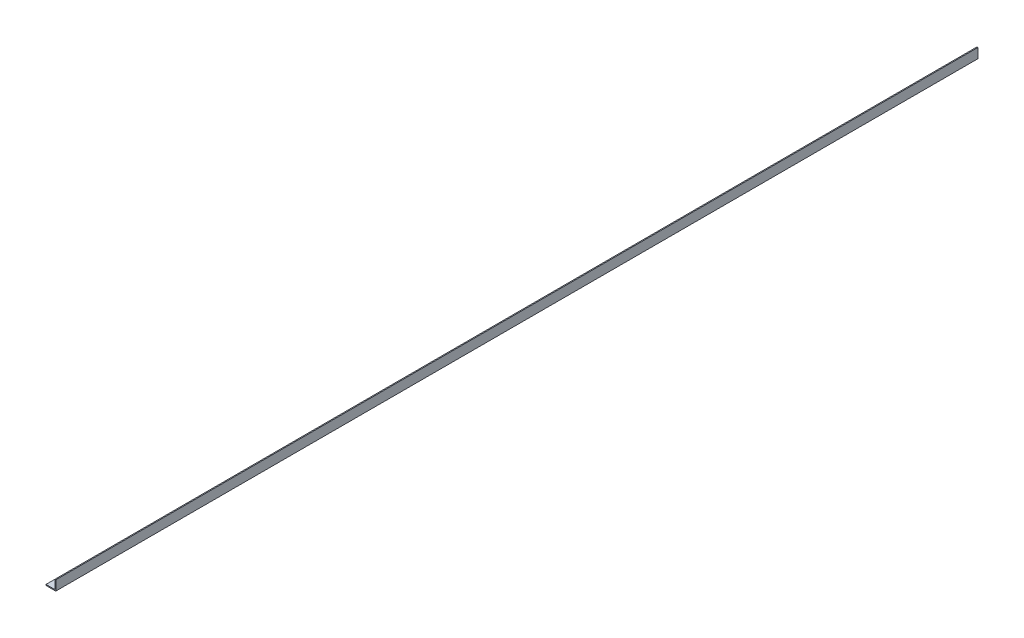
ISO-10303-21;
HEADER;
FILE_DESCRIPTION(('STEP AP214'),'2;1');
FILE_NAME('part.step','',(''),(''),'','','');
FILE_SCHEMA(('AUTOMOTIVE_DESIGN { 1 0 10303 214 1 1 1 1 }'));
ENDSEC;
DATA;
#1=APPLICATION_CONTEXT('core data for automotive mechanical design processes');
#2=APPLICATION_PROTOCOL_DEFINITION('international standard','automotive_design',2000,#1);
#3=PRODUCT_CONTEXT('',#1,'mechanical');
#4=PRODUCT('Part','Part','',(#3));
#5=PRODUCT_RELATED_PRODUCT_CATEGORY('part','',(#4));
#6=PRODUCT_DEFINITION_FORMATION('','',#4);
#7=PRODUCT_DEFINITION_CONTEXT('part definition',#1,'design');
#8=PRODUCT_DEFINITION('design','',#6,#7);
#9=PRODUCT_DEFINITION_SHAPE('','',#8);
#10=(LENGTH_UNIT() NAMED_UNIT(*) SI_UNIT(.MILLI.,.METRE.));
#11=(NAMED_UNIT(*) PLANE_ANGLE_UNIT() SI_UNIT($,.RADIAN.));
#12=(NAMED_UNIT(*) SI_UNIT($,.STERADIAN.) SOLID_ANGLE_UNIT());
#13=UNCERTAINTY_MEASURE_WITH_UNIT(LENGTH_MEASURE(1.E-05),#10,'distance_accuracy_value','');
#14=(GEOMETRIC_REPRESENTATION_CONTEXT(3) GLOBAL_UNCERTAINTY_ASSIGNED_CONTEXT((#13)) GLOBAL_UNIT_ASSIGNED_CONTEXT((#10,
#11,#12)) REPRESENTATION_CONTEXT('',''));
#15=CARTESIAN_POINT('',(0.,0.,0.));
#16=DIRECTION('',(0.,0.,1.));
#17=DIRECTION('',(1.,0.,0.));
#18=AXIS2_PLACEMENT_3D('',#15,#16,#17);
#19=CARTESIAN_POINT('',(0.,0.,6000.));
#20=DIRECTION('',(-1.,0.,0.));
#21=DIRECTION('',(0.,0.,1.));
#22=AXIS2_PLACEMENT_3D('',#19,#20,#21);
#23=PLANE('',#22);
#24=DIRECTION('',(0.,1.,0.));
#25=VECTOR('',#24,1.);
#26=CARTESIAN_POINT('',(0.,0.,0.));
#27=LINE('',#26,#25);
#28=CARTESIAN_POINT('',(0.,0.,0.));
#29=VERTEX_POINT('',#28);
#30=CARTESIAN_POINT('',(0.,63.5,0.));
#31=VERTEX_POINT('',#30);
#32=EDGE_CURVE('E119',#29,#31,#27,.T.);
#33=ORIENTED_EDGE('',*,*,#32,.T.);
#34=DIRECTION('',(0.,0.,-1.));
#35=VECTOR('',#34,1.);
#36=CARTESIAN_POINT('',(0.,63.5,6000.));
#37=LINE('',#36,#35);
#38=CARTESIAN_POINT('',(0.,63.5,6000.));
#39=VERTEX_POINT('',#38);
#40=EDGE_CURVE('E11',#39,#31,#37,.T.);
#41=ORIENTED_EDGE('',*,*,#40,.F.);
#42=DIRECTION('',(0.,1.,0.));
#43=VECTOR('',#42,1.);
#44=CARTESIAN_POINT('',(0.,0.,6000.));
#45=LINE('',#44,#43);
#46=CARTESIAN_POINT('',(0.,0.,6000.));
#47=VERTEX_POINT('',#46);
#48=EDGE_CURVE('E129',#47,#39,#45,.T.);
#49=ORIENTED_EDGE('',*,*,#48,.F.);
#50=DIRECTION('',(0.,0.,-1.));
#51=VECTOR('',#50,1.);
#52=CARTESIAN_POINT('',(0.,0.,6000.));
#53=LINE('',#52,#51);
#54=EDGE_CURVE('E115',#47,#29,#53,.T.);
#55=ORIENTED_EDGE('',*,*,#54,.T.);
#56=EDGE_LOOP('',(#33,#41,#49,#55));
#57=FACE_BOUND('',#56,.T.);
#58=ADVANCED_FACE('F35',(#57),#23,.F.);
#59=CARTESIAN_POINT('',(-6.35,63.5,6000.));
#60=DIRECTION('',(0.,-1.,0.));
#61=DIRECTION('',(0.,0.,-1.));
#62=AXIS2_PLACEMENT_3D('',#59,#60,#61);
#63=PLANE('',#62);
#64=DIRECTION('',(-1.,0.,0.));
#65=VECTOR('',#64,1.);
#66=CARTESIAN_POINT('',(-6.35,63.5,0.));
#67=LINE('',#66,#65);
#68=CARTESIAN_POINT('',(-6.35,63.5,0.));
#69=VERTEX_POINT('',#68);
#70=EDGE_CURVE('E122',#31,#69,#67,.T.);
#71=ORIENTED_EDGE('',*,*,#70,.T.);
#72=DIRECTION('',(0.,0.,-1.));
#73=VECTOR('',#72,1.);
#74=CARTESIAN_POINT('',(-6.35,63.5,6000.));
#75=LINE('',#74,#73);
#76=CARTESIAN_POINT('',(-6.35,63.5,6000.));
#77=VERTEX_POINT('',#76);
#78=EDGE_CURVE('E43',#77,#69,#75,.T.);
#79=ORIENTED_EDGE('',*,*,#78,.F.);
#80=DIRECTION('',(-1.,0.,0.));
#81=VECTOR('',#80,1.);
#82=CARTESIAN_POINT('',(-6.35,63.5,6000.));
#83=LINE('',#82,#81);
#84=EDGE_CURVE('E88',#39,#77,#83,.T.);
#85=ORIENTED_EDGE('',*,*,#84,.F.);
#86=ORIENTED_EDGE('',*,*,#40,.T.);
#87=EDGE_LOOP('',(#71,#79,#85,#86));
#88=FACE_BOUND('',#87,.T.);
#89=ADVANCED_FACE('F153',(#88),#63,.F.);
#90=CARTESIAN_POINT('',(-6.35,6.35,6000.));
#91=DIRECTION('',(1.,0.,0.));
#92=DIRECTION('',(0.,0.,-1.));
#93=AXIS2_PLACEMENT_3D('',#90,#91,#92);
#94=PLANE('',#93);
#95=DIRECTION('',(0.,-1.,0.));
#96=VECTOR('',#95,1.);
#97=CARTESIAN_POINT('',(-6.35,6.35,0.));
#98=LINE('',#97,#96);
#99=CARTESIAN_POINT('',(-6.35,6.35,0.));
#100=VERTEX_POINT('',#99);
#101=EDGE_CURVE('E124',#69,#100,#98,.T.);
#102=ORIENTED_EDGE('',*,*,#101,.T.);
#103=DIRECTION('',(0.,0.,-1.));
#104=VECTOR('',#103,1.);
#105=CARTESIAN_POINT('',(-6.35,6.35,6000.));
#106=LINE('',#105,#104);
#107=CARTESIAN_POINT('',(-6.35,6.35,6000.));
#108=VERTEX_POINT('',#107);
#109=EDGE_CURVE('E110',#108,#100,#106,.T.);
#110=ORIENTED_EDGE('',*,*,#109,.F.);
#111=DIRECTION('',(0.,-1.,0.));
#112=VECTOR('',#111,1.);
#113=CARTESIAN_POINT('',(-6.35,6.35,6000.));
#114=LINE('',#113,#112);
#115=EDGE_CURVE('E101',#77,#108,#114,.T.);
#116=ORIENTED_EDGE('',*,*,#115,.F.);
#117=ORIENTED_EDGE('',*,*,#78,.T.);
#118=EDGE_LOOP('',(#102,#110,#116,#117));
#119=FACE_BOUND('',#118,.T.);
#120=ADVANCED_FACE('F135',(#119),#94,.F.);
#121=CARTESIAN_POINT('',(-6.35,6.35,6000.));
#122=DIRECTION('',(0.,-1.,0.));
#123=DIRECTION('',(0.,0.,-1.));
#124=AXIS2_PLACEMENT_3D('',#121,#122,#123);
#125=PLANE('',#124);
#126=DIRECTION('',(-1.,0.,0.));
#127=VECTOR('',#126,1.);
#128=CARTESIAN_POINT('',(-6.35,6.35,0.));
#129=LINE('',#128,#127);
#130=CARTESIAN_POINT('',(-63.5,6.35,0.));
#131=VERTEX_POINT('',#130);
#132=EDGE_CURVE('E109',#100,#131,#129,.T.);
#133=ORIENTED_EDGE('',*,*,#132,.T.);
#134=DIRECTION('',(0.,0.,-1.));
#135=VECTOR('',#134,1.);
#136=CARTESIAN_POINT('',(-63.5,6.35,6000.));
#137=LINE('',#136,#135);
#138=CARTESIAN_POINT('',(-63.5,6.35,6000.));
#139=VERTEX_POINT('',#138);
#140=EDGE_CURVE('E106',#139,#131,#137,.T.);
#141=ORIENTED_EDGE('',*,*,#140,.F.);
#142=DIRECTION('',(-1.,0.,0.));
#143=VECTOR('',#142,1.);
#144=CARTESIAN_POINT('',(-6.35,6.35,6000.));
#145=LINE('',#144,#143);
#146=EDGE_CURVE('E95',#108,#139,#145,.T.);
#147=ORIENTED_EDGE('',*,*,#146,.F.);
#148=ORIENTED_EDGE('',*,*,#109,.T.);
#149=EDGE_LOOP('',(#133,#141,#147,#148));
#150=FACE_BOUND('',#149,.T.);
#151=ADVANCED_FACE('F107',(#150),#125,.F.);
#152=CARTESIAN_POINT('',(-63.5,6.35,6000.));
#153=DIRECTION('',(1.,0.,0.));
#154=DIRECTION('',(0.,0.,-1.));
#155=AXIS2_PLACEMENT_3D('',#152,#153,#154);
#156=PLANE('',#155);
#157=DIRECTION('',(0.,-1.,0.));
#158=VECTOR('',#157,1.);
#159=CARTESIAN_POINT('',(-63.5,6.35,0.));
#160=LINE('',#159,#158);
#161=CARTESIAN_POINT('',(-63.5,0.,0.));
#162=VERTEX_POINT('',#161);
#163=EDGE_CURVE('E74',#131,#162,#160,.T.);
#164=ORIENTED_EDGE('',*,*,#163,.T.);
#165=DIRECTION('',(0.,0.,-1.));
#166=VECTOR('',#165,1.);
#167=CARTESIAN_POINT('',(-63.5,0.,6000.));
#168=LINE('',#167,#166);
#169=CARTESIAN_POINT('',(-63.5,0.,6000.));
#170=VERTEX_POINT('',#169);
#171=EDGE_CURVE('E111',#170,#162,#168,.T.);
#172=ORIENTED_EDGE('',*,*,#171,.F.);
#173=DIRECTION('',(0.,-1.,0.));
#174=VECTOR('',#173,1.);
#175=CARTESIAN_POINT('',(-63.5,6.35,6000.));
#176=LINE('',#175,#174);
#177=EDGE_CURVE('E99',#139,#170,#176,.T.);
#178=ORIENTED_EDGE('',*,*,#177,.F.);
#179=ORIENTED_EDGE('',*,*,#140,.T.);
#180=EDGE_LOOP('',(#164,#172,#178,#179));
#181=FACE_BOUND('',#180,.T.);
#182=ADVANCED_FACE('F113',(#181),#156,.F.);
#183=CARTESIAN_POINT('',(0.,0.,6000.));
#184=DIRECTION('',(0.,1.,0.));
#185=DIRECTION('',(0.,0.,1.));
#186=AXIS2_PLACEMENT_3D('',#183,#184,#185);
#187=PLANE('',#186);
#188=DIRECTION('',(1.,0.,0.));
#189=VECTOR('',#188,1.);
#190=CARTESIAN_POINT('',(0.,0.,0.));
#191=LINE('',#190,#189);
#192=EDGE_CURVE('E80',#162,#29,#191,.T.);
#193=ORIENTED_EDGE('',*,*,#192,.T.);
#194=ORIENTED_EDGE('',*,*,#54,.F.);
#195=DIRECTION('',(1.,0.,0.));
#196=VECTOR('',#195,1.);
#197=CARTESIAN_POINT('',(0.,0.,6000.));
#198=LINE('',#197,#196);
#199=EDGE_CURVE('E51',#170,#47,#198,.T.);
#200=ORIENTED_EDGE('',*,*,#199,.F.);
#201=ORIENTED_EDGE('',*,*,#171,.T.);
#202=EDGE_LOOP('',(#193,#194,#200,#201));
#203=FACE_BOUND('',#202,.T.);
#204=ADVANCED_FACE('F142',(#203),#187,.F.);
#205=CARTESIAN_POINT('',(0.,0.,6000.));
#206=DIRECTION('',(0.,0.,-1.));
#207=DIRECTION('',(-1.,0.,0.));
#208=AXIS2_PLACEMENT_3D('',#205,#206,#207);
#209=PLANE('',#208);
#210=ORIENTED_EDGE('',*,*,#48,.T.);
#211=ORIENTED_EDGE('',*,*,#84,.T.);
#212=ORIENTED_EDGE('',*,*,#115,.T.);
#213=ORIENTED_EDGE('',*,*,#146,.T.);
#214=ORIENTED_EDGE('',*,*,#177,.T.);
#215=ORIENTED_EDGE('',*,*,#199,.T.);
#216=EDGE_LOOP('',(#210,#211,#212,#213,#214,#215));
#217=FACE_BOUND('',#216,.T.);
#218=ADVANCED_FACE('F97',(#217),#209,.F.);
#219=CARTESIAN_POINT('',(0.,0.,0.));
#220=DIRECTION('',(0.,0.,-1.));
#221=DIRECTION('',(-1.,0.,0.));
#222=AXIS2_PLACEMENT_3D('',#219,#220,#221);
#223=PLANE('',#222);
#224=ORIENTED_EDGE('',*,*,#32,.F.);
#225=ORIENTED_EDGE('',*,*,#192,.F.);
#226=ORIENTED_EDGE('',*,*,#163,.F.);
#227=ORIENTED_EDGE('',*,*,#132,.F.);
#228=ORIENTED_EDGE('',*,*,#101,.F.);
#229=ORIENTED_EDGE('',*,*,#70,.F.);
#230=EDGE_LOOP('',(#224,#225,#226,#227,#228,#229));
#231=FACE_BOUND('',#230,.T.);
#232=ADVANCED_FACE('F138',(#231),#223,.T.);
#233=CLOSED_SHELL('',(#58,#89,#120,#151,#182,#204,#218,#232));
#234=MANIFOLD_SOLID_BREP('B2',#233);
#235=ADVANCED_BREP_SHAPE_REPRESENTATION('',(#18,#234),#14);
#236=SHAPE_DEFINITION_REPRESENTATION(#9,#235);
ENDSEC;
END-ISO-10303-21;
